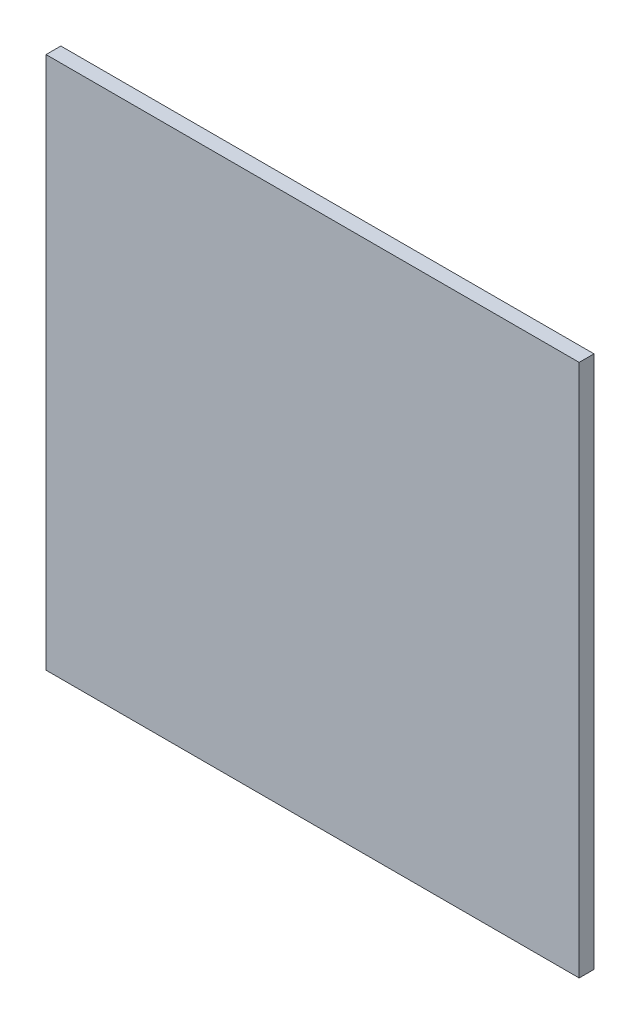
ISO-10303-21;
HEADER;
FILE_DESCRIPTION(('STEP AP214'),'2;1');
FILE_NAME('part.step','',(''),(''),'','','');
FILE_SCHEMA(('AUTOMOTIVE_DESIGN { 1 0 10303 214 1 1 1 1 }'));
ENDSEC;
DATA;
#1=APPLICATION_CONTEXT('core data for automotive mechanical design processes');
#2=APPLICATION_PROTOCOL_DEFINITION('international standard','automotive_design',2000,#1);
#3=PRODUCT_CONTEXT('',#1,'mechanical');
#4=PRODUCT('Part','Part','',(#3));
#5=PRODUCT_RELATED_PRODUCT_CATEGORY('part','',(#4));
#6=PRODUCT_DEFINITION_FORMATION('','',#4);
#7=PRODUCT_DEFINITION_CONTEXT('part definition',#1,'design');
#8=PRODUCT_DEFINITION('design','',#6,#7);
#9=PRODUCT_DEFINITION_SHAPE('','',#8);
#10=(LENGTH_UNIT() NAMED_UNIT(*) SI_UNIT(.MILLI.,.METRE.));
#11=(NAMED_UNIT(*) PLANE_ANGLE_UNIT() SI_UNIT($,.RADIAN.));
#12=(NAMED_UNIT(*) SI_UNIT($,.STERADIAN.) SOLID_ANGLE_UNIT());
#13=UNCERTAINTY_MEASURE_WITH_UNIT(LENGTH_MEASURE(1.E-05),#10,'distance_accuracy_value','');
#14=(GEOMETRIC_REPRESENTATION_CONTEXT(3) GLOBAL_UNCERTAINTY_ASSIGNED_CONTEXT((#13)) GLOBAL_UNIT_ASSIGNED_CONTEXT((#10,
#11,#12)) REPRESENTATION_CONTEXT('',''));
#15=CARTESIAN_POINT('',(0.,0.,0.));
#16=DIRECTION('',(0.,0.,1.));
#17=DIRECTION('',(1.,0.,0.));
#18=AXIS2_PLACEMENT_3D('',#15,#16,#17);
#19=CARTESIAN_POINT('',(45.,-45.,1.25));
#20=DIRECTION('',(-1.,0.,0.));
#21=DIRECTION('',(0.,0.,1.));
#22=AXIS2_PLACEMENT_3D('',#19,#20,#21);
#23=PLANE('',#22);
#24=DIRECTION('',(0.,1.,0.));
#25=VECTOR('',#24,1.);
#26=CARTESIAN_POINT('',(45.,-45.,-1.25));
#27=LINE('',#26,#25);
#28=CARTESIAN_POINT('',(45.,-45.,-1.25));
#29=VERTEX_POINT('',#28);
#30=CARTESIAN_POINT('',(45.,45.,-1.25));
#31=VERTEX_POINT('',#30);
#32=EDGE_CURVE('E111',#29,#31,#27,.T.);
#33=ORIENTED_EDGE('',*,*,#32,.T.);
#34=DIRECTION('',(0.,0.,-1.));
#35=VECTOR('',#34,1.);
#36=CARTESIAN_POINT('',(45.,45.,1.25));
#37=LINE('',#36,#35);
#38=CARTESIAN_POINT('',(45.,45.,1.25));
#39=VERTEX_POINT('',#38);
#40=EDGE_CURVE('E11',#39,#31,#37,.T.);
#41=ORIENTED_EDGE('',*,*,#40,.F.);
#42=DIRECTION('',(0.,1.,0.));
#43=VECTOR('',#42,1.);
#44=CARTESIAN_POINT('',(45.,-45.,1.25));
#45=LINE('',#44,#43);
#46=CARTESIAN_POINT('',(45.,-45.,1.25));
#47=VERTEX_POINT('',#46);
#48=EDGE_CURVE('E95',#47,#39,#45,.T.);
#49=ORIENTED_EDGE('',*,*,#48,.F.);
#50=DIRECTION('',(0.,0.,-1.));
#51=VECTOR('',#50,1.);
#52=CARTESIAN_POINT('',(45.,-45.,1.25));
#53=LINE('',#52,#51);
#54=EDGE_CURVE('E107',#47,#29,#53,.T.);
#55=ORIENTED_EDGE('',*,*,#54,.T.);
#56=EDGE_LOOP('',(#33,#41,#49,#55));
#57=FACE_BOUND('',#56,.T.);
#58=ADVANCED_FACE('F43',(#57),#23,.F.);
#59=CARTESIAN_POINT('',(-45.,45.,1.25));
#60=DIRECTION('',(0.,-1.,0.));
#61=DIRECTION('',(0.,0.,-1.));
#62=AXIS2_PLACEMENT_3D('',#59,#60,#61);
#63=PLANE('',#62);
#64=DIRECTION('',(-1.,0.,0.));
#65=VECTOR('',#64,1.);
#66=CARTESIAN_POINT('',(-45.,45.,-1.25));
#67=LINE('',#66,#65);
#68=CARTESIAN_POINT('',(-45.,45.,-1.25));
#69=VERTEX_POINT('',#68);
#70=EDGE_CURVE('E100',#31,#69,#67,.T.);
#71=ORIENTED_EDGE('',*,*,#70,.T.);
#72=DIRECTION('',(0.,0.,-1.));
#73=VECTOR('',#72,1.);
#74=CARTESIAN_POINT('',(-45.,45.,1.25));
#75=LINE('',#74,#73);
#76=CARTESIAN_POINT('',(-45.,45.,1.25));
#77=VERTEX_POINT('',#76);
#78=EDGE_CURVE('E52',#77,#69,#75,.T.);
#79=ORIENTED_EDGE('',*,*,#78,.F.);
#80=DIRECTION('',(-1.,0.,0.));
#81=VECTOR('',#80,1.);
#82=CARTESIAN_POINT('',(-45.,45.,1.25));
#83=LINE('',#82,#81);
#84=EDGE_CURVE('E90',#39,#77,#83,.T.);
#85=ORIENTED_EDGE('',*,*,#84,.F.);
#86=ORIENTED_EDGE('',*,*,#40,.T.);
#87=EDGE_LOOP('',(#71,#79,#85,#86));
#88=FACE_BOUND('',#87,.T.);
#89=ADVANCED_FACE('F99',(#88),#63,.F.);
#90=CARTESIAN_POINT('',(-45.,-45.,1.25));
#91=DIRECTION('',(1.,0.,0.));
#92=DIRECTION('',(0.,0.,-1.));
#93=AXIS2_PLACEMENT_3D('',#90,#91,#92);
#94=PLANE('',#93);
#95=DIRECTION('',(0.,-1.,0.));
#96=VECTOR('',#95,1.);
#97=CARTESIAN_POINT('',(-45.,-45.,-1.25));
#98=LINE('',#97,#96);
#99=CARTESIAN_POINT('',(-45.,-45.,-1.25));
#100=VERTEX_POINT('',#99);
#101=EDGE_CURVE('E77',#69,#100,#98,.T.);
#102=ORIENTED_EDGE('',*,*,#101,.T.);
#103=DIRECTION('',(0.,0.,-1.));
#104=VECTOR('',#103,1.);
#105=CARTESIAN_POINT('',(-45.,-45.,1.25));
#106=LINE('',#105,#104);
#107=CARTESIAN_POINT('',(-45.,-45.,1.25));
#108=VERTEX_POINT('',#107);
#109=EDGE_CURVE('E102',#108,#100,#106,.T.);
#110=ORIENTED_EDGE('',*,*,#109,.F.);
#111=DIRECTION('',(0.,-1.,0.));
#112=VECTOR('',#111,1.);
#113=CARTESIAN_POINT('',(-45.,-45.,1.25));
#114=LINE('',#113,#112);
#115=EDGE_CURVE('E93',#77,#108,#114,.T.);
#116=ORIENTED_EDGE('',*,*,#115,.F.);
#117=ORIENTED_EDGE('',*,*,#78,.T.);
#118=EDGE_LOOP('',(#102,#110,#116,#117));
#119=FACE_BOUND('',#118,.T.);
#120=ADVANCED_FACE('F103',(#119),#94,.F.);
#121=CARTESIAN_POINT('',(-45.,-45.,1.25));
#122=DIRECTION('',(0.,1.,0.));
#123=DIRECTION('',(0.,0.,1.));
#124=AXIS2_PLACEMENT_3D('',#121,#122,#123);
#125=PLANE('',#124);
#126=DIRECTION('',(1.,0.,0.));
#127=VECTOR('',#126,1.);
#128=CARTESIAN_POINT('',(-45.,-45.,-1.25));
#129=LINE('',#128,#127);
#130=EDGE_CURVE('E83',#100,#29,#129,.T.);
#131=ORIENTED_EDGE('',*,*,#130,.T.);
#132=ORIENTED_EDGE('',*,*,#54,.F.);
#133=DIRECTION('',(1.,0.,0.));
#134=VECTOR('',#133,1.);
#135=CARTESIAN_POINT('',(-45.,-45.,1.25));
#136=LINE('',#135,#134);
#137=EDGE_CURVE('E60',#108,#47,#136,.T.);
#138=ORIENTED_EDGE('',*,*,#137,.F.);
#139=ORIENTED_EDGE('',*,*,#109,.T.);
#140=EDGE_LOOP('',(#131,#132,#138,#139));
#141=FACE_BOUND('',#140,.T.);
#142=ADVANCED_FACE('F124',(#141),#125,.F.);
#143=CARTESIAN_POINT('',(0.,0.,1.25));
#144=DIRECTION('',(0.,0.,-1.));
#145=DIRECTION('',(-1.,0.,0.));
#146=AXIS2_PLACEMENT_3D('',#143,#144,#145);
#147=PLANE('',#146);
#148=ORIENTED_EDGE('',*,*,#48,.T.);
#149=ORIENTED_EDGE('',*,*,#84,.T.);
#150=ORIENTED_EDGE('',*,*,#115,.T.);
#151=ORIENTED_EDGE('',*,*,#137,.T.);
#152=EDGE_LOOP('',(#148,#149,#150,#151));
#153=FACE_BOUND('',#152,.T.);
#154=ADVANCED_FACE('F91',(#153),#147,.F.);
#155=CARTESIAN_POINT('',(0.,0.,-1.25));
#156=DIRECTION('',(0.,0.,-1.));
#157=DIRECTION('',(-1.,0.,0.));
#158=AXIS2_PLACEMENT_3D('',#155,#156,#157);
#159=PLANE('',#158);
#160=ORIENTED_EDGE('',*,*,#32,.F.);
#161=ORIENTED_EDGE('',*,*,#130,.F.);
#162=ORIENTED_EDGE('',*,*,#101,.F.);
#163=ORIENTED_EDGE('',*,*,#70,.F.);
#164=EDGE_LOOP('',(#160,#161,#162,#163));
#165=FACE_BOUND('',#164,.T.);
#166=ADVANCED_FACE('F127',(#165),#159,.T.);
#167=CLOSED_SHELL('',(#58,#89,#120,#142,#154,#166));
#168=MANIFOLD_SOLID_BREP('B2',#167);
#169=ADVANCED_BREP_SHAPE_REPRESENTATION('',(#18,#168),#14);
#170=SHAPE_DEFINITION_REPRESENTATION(#9,#169);
ENDSEC;
END-ISO-10303-21;
